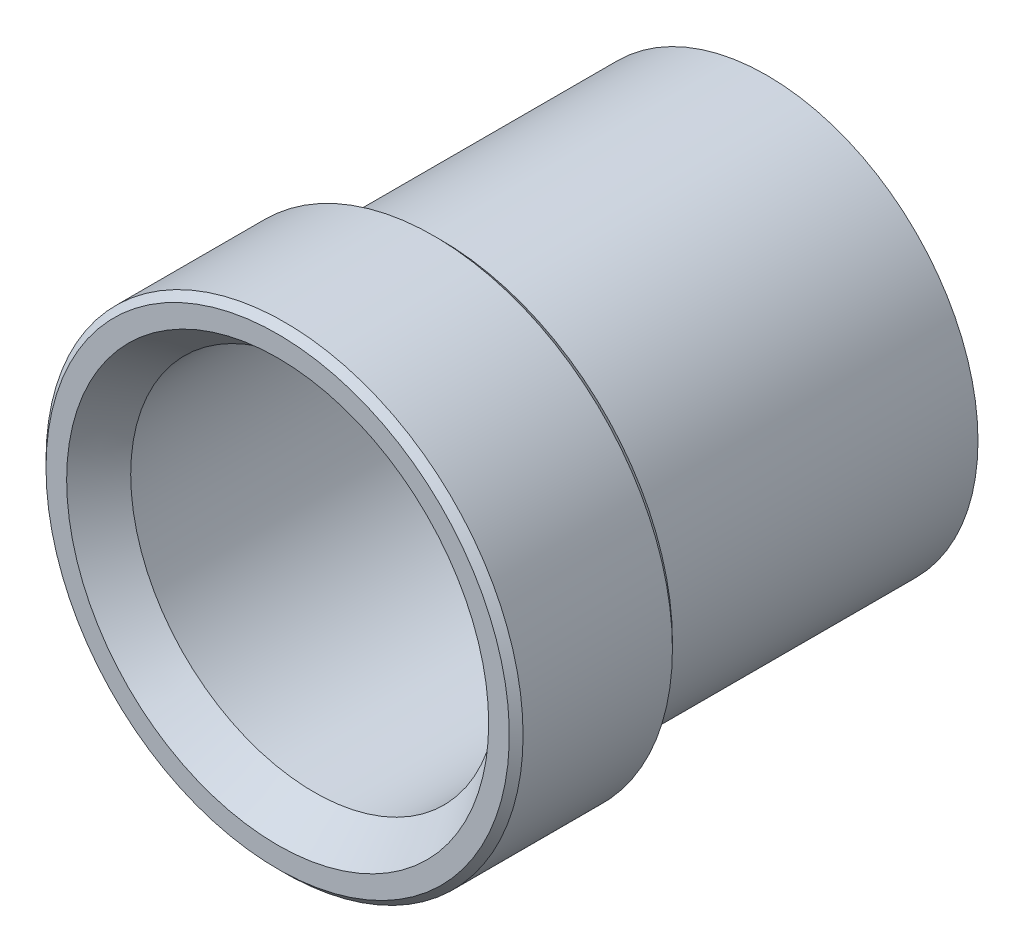
ISO-10303-21;
HEADER;
FILE_DESCRIPTION(('STEP AP214'),'2;1');
FILE_NAME('part.step','',(''),(''),'','','');
FILE_SCHEMA(('AUTOMOTIVE_DESIGN { 1 0 10303 214 1 1 1 1 }'));
ENDSEC;
DATA;
#1=APPLICATION_CONTEXT('core data for automotive mechanical design processes');
#2=APPLICATION_PROTOCOL_DEFINITION('international standard','automotive_design',2000,#1);
#3=PRODUCT_CONTEXT('',#1,'mechanical');
#4=PRODUCT('Part','Part','',(#3));
#5=PRODUCT_RELATED_PRODUCT_CATEGORY('part','',(#4));
#6=PRODUCT_DEFINITION_FORMATION('','',#4);
#7=PRODUCT_DEFINITION_CONTEXT('part definition',#1,'design');
#8=PRODUCT_DEFINITION('design','',#6,#7);
#9=PRODUCT_DEFINITION_SHAPE('','',#8);
#10=(LENGTH_UNIT() NAMED_UNIT(*) SI_UNIT(.MILLI.,.METRE.));
#11=(NAMED_UNIT(*) PLANE_ANGLE_UNIT() SI_UNIT($,.RADIAN.));
#12=(NAMED_UNIT(*) SI_UNIT($,.STERADIAN.) SOLID_ANGLE_UNIT());
#13=UNCERTAINTY_MEASURE_WITH_UNIT(LENGTH_MEASURE(1.E-05),#10,'distance_accuracy_value','');
#14=(GEOMETRIC_REPRESENTATION_CONTEXT(3) GLOBAL_UNCERTAINTY_ASSIGNED_CONTEXT((#13)) GLOBAL_UNIT_ASSIGNED_CONTEXT((#10,
#11,#12)) REPRESENTATION_CONTEXT('',''));
#15=CARTESIAN_POINT('',(0.,0.,0.));
#16=DIRECTION('',(0.,0.,1.));
#17=DIRECTION('',(1.,0.,0.));
#18=AXIS2_PLACEMENT_3D('',#15,#16,#17);
#19=CARTESIAN_POINT('',(0.,0.,6.35));
#20=DIRECTION('',(0.,0.,1.));
#21=DIRECTION('',(1.,0.,0.));
#22=AXIS2_PLACEMENT_3D('',#19,#20,#21);
#23=CYLINDRICAL_SURFACE('',#22,4.7625);
#24=CARTESIAN_POINT('',(0.,0.,-6.35));
#25=DIRECTION('',(0.,0.,1.));
#26=DIRECTION('',(1.,0.,0.));
#27=AXIS2_PLACEMENT_3D('',#24,#25,#26);
#28=CIRCLE('',#27,4.7625);
#29=CARTESIAN_POINT('',(4.7625,0.,-6.35));
#30=VERTEX_POINT('',#29);
#31=EDGE_CURVE('E65',#30,#30,#28,.T.);
#32=ORIENTED_EDGE('',*,*,#31,.F.);
#33=EDGE_LOOP('',(#32));
#34=FACE_BOUND('',#33,.T.);
#35=CARTESIAN_POINT('',(0.,0.,5.40199235555492));
#36=DIRECTION('',(0.,0.,1.));
#37=DIRECTION('',(1.,0.,0.));
#38=AXIS2_PLACEMENT_3D('',#35,#36,#37);
#39=CIRCLE('',#38,4.7625);
#40=CARTESIAN_POINT('',(4.7625,0.,5.40199235555492));
#41=VERTEX_POINT('',#40);
#42=EDGE_CURVE('E53',#41,#41,#39,.T.);
#43=ORIENTED_EDGE('',*,*,#42,.T.);
#44=EDGE_LOOP('',(#43));
#45=FACE_BOUND('',#44,.T.);
#46=ADVANCED_FACE('F33',(#34,#45),#23,.F.);
#47=CARTESIAN_POINT('',(0.,0.,6.35));
#48=DIRECTION('',(0.,0.,1.));
#49=DIRECTION('',(1.,0.,0.));
#50=AXIS2_PLACEMENT_3D('',#47,#48,#49);
#51=CONICAL_SURFACE('',#50,5.476875,0.645771823237903);
#52=ORIENTED_EDGE('',*,*,#42,.F.);
#53=EDGE_LOOP('',(#52));
#54=FACE_BOUND('',#53,.T.);
#55=CARTESIAN_POINT('',(0.,0.,6.35));
#56=DIRECTION('',(0.,0.,1.));
#57=DIRECTION('',(1.,0.,0.));
#58=AXIS2_PLACEMENT_3D('',#55,#56,#57);
#59=CIRCLE('',#58,5.476875);
#60=CARTESIAN_POINT('',(5.476875,0.,6.35));
#61=VERTEX_POINT('',#60);
#62=EDGE_CURVE('E56',#61,#61,#59,.T.);
#63=ORIENTED_EDGE('',*,*,#62,.T.);
#64=EDGE_LOOP('',(#63));
#65=FACE_BOUND('',#64,.T.);
#66=ADVANCED_FACE('F73',(#54,#65),#51,.F.);
#67=CARTESIAN_POINT('',(0.,5.476875,6.35));
#68=DIRECTION('',(0.,0.,-1.));
#69=DIRECTION('',(-1.,0.,0.));
#70=AXIS2_PLACEMENT_3D('',#67,#68,#69);
#71=PLANE('',#70);
#72=CARTESIAN_POINT('',(0.,0.,6.35));
#73=DIRECTION('',(0.,0.,-1.));
#74=DIRECTION('',(-1.,0.,0.));
#75=AXIS2_PLACEMENT_3D('',#72,#73,#74);
#76=CIRCLE('',#75,6.01265625);
#77=CARTESIAN_POINT('',(-6.01265625,0.,6.35));
#78=VERTEX_POINT('',#77);
#79=EDGE_CURVE('E48',#78,#78,#76,.F.);
#80=ORIENTED_EDGE('',*,*,#79,.T.);
#81=EDGE_LOOP('',(#80));
#82=FACE_BOUND('',#81,.T.);
#83=ORIENTED_EDGE('',*,*,#62,.F.);
#84=EDGE_LOOP('',(#83));
#85=FACE_BOUND('',#84,.T.);
#86=ADVANCED_FACE('F79',(#82,#85),#71,.F.);
#87=CARTESIAN_POINT('',(0.,0.,6.35));
#88=DIRECTION('',(0.,0.,1.));
#89=DIRECTION('',(1.,0.,0.));
#90=AXIS2_PLACEMENT_3D('',#87,#88,#89);
#91=CYLINDRICAL_SURFACE('',#90,6.19125);
#92=CARTESIAN_POINT('',(0.,0.,6.17140625));
#93=DIRECTION('',(0.,0.,-1.));
#94=DIRECTION('',(-1.,0.,0.));
#95=AXIS2_PLACEMENT_3D('',#92,#93,#94);
#96=CIRCLE('',#95,6.19125);
#97=CARTESIAN_POINT('',(-6.19125,0.,6.17140625));
#98=VERTEX_POINT('',#97);
#99=EDGE_CURVE('E40',#98,#98,#96,.T.);
#100=ORIENTED_EDGE('',*,*,#99,.T.);
#101=EDGE_LOOP('',(#100));
#102=FACE_BOUND('',#101,.T.);
#103=CARTESIAN_POINT('',(0.,0.,2.29526041666667));
#104=DIRECTION('',(0.,0.,1.));
#105=DIRECTION('',(1.,0.,0.));
#106=AXIS2_PLACEMENT_3D('',#103,#104,#105);
#107=CIRCLE('',#106,6.19125);
#108=CARTESIAN_POINT('',(6.19125,0.,2.29526041666667));
#109=VERTEX_POINT('',#108);
#110=EDGE_CURVE('E44',#109,#109,#107,.T.);
#111=ORIENTED_EDGE('',*,*,#110,.T.);
#112=EDGE_LOOP('',(#111));
#113=FACE_BOUND('',#112,.T.);
#114=ADVANCED_FACE('F84',(#102,#113),#91,.T.);
#115=CARTESIAN_POINT('',(0.,6.19125,2.11666666666667));
#116=DIRECTION('',(0.,0.,1.));
#117=DIRECTION('',(1.,0.,0.));
#118=AXIS2_PLACEMENT_3D('',#115,#116,#117);
#119=PLANE('',#118);
#120=CARTESIAN_POINT('',(0.,0.,2.11666666666667));
#121=DIRECTION('',(0.,0.,1.));
#122=DIRECTION('',(1.,0.,0.));
#123=AXIS2_PLACEMENT_3D('',#120,#121,#122);
#124=CIRCLE('',#123,6.01265625);
#125=CARTESIAN_POINT('',(6.01265625,0.,2.11666666666667));
#126=VERTEX_POINT('',#125);
#127=EDGE_CURVE('E10',#126,#126,#124,.F.);
#128=ORIENTED_EDGE('',*,*,#127,.T.);
#129=EDGE_LOOP('',(#128));
#130=FACE_BOUND('',#129,.T.);
#131=CARTESIAN_POINT('',(0.,0.,2.11666666666667));
#132=DIRECTION('',(0.,0.,1.));
#133=DIRECTION('',(1.,0.,0.));
#134=AXIS2_PLACEMENT_3D('',#131,#132,#133);
#135=CIRCLE('',#134,5.476875);
#136=CARTESIAN_POINT('',(5.476875,0.,2.11666666666667));
#137=VERTEX_POINT('',#136);
#138=EDGE_CURVE('E59',#137,#137,#135,.T.);
#139=ORIENTED_EDGE('',*,*,#138,.T.);
#140=EDGE_LOOP('',(#139));
#141=FACE_BOUND('',#140,.T.);
#142=ADVANCED_FACE('F90',(#130,#141),#119,.F.);
#143=CARTESIAN_POINT('',(0.,0.,6.35));
#144=DIRECTION('',(0.,0.,1.));
#145=DIRECTION('',(1.,0.,0.));
#146=AXIS2_PLACEMENT_3D('',#143,#144,#145);
#147=CYLINDRICAL_SURFACE('',#146,5.476875);
#148=ORIENTED_EDGE('',*,*,#138,.F.);
#149=EDGE_LOOP('',(#148));
#150=FACE_BOUND('',#149,.T.);
#151=CARTESIAN_POINT('',(0.,0.,-6.35));
#152=DIRECTION('',(0.,0.,1.));
#153=DIRECTION('',(1.,0.,0.));
#154=AXIS2_PLACEMENT_3D('',#151,#152,#153);
#155=CIRCLE('',#154,5.476875);
#156=CARTESIAN_POINT('',(5.476875,0.,-6.35));
#157=VERTEX_POINT('',#156);
#158=EDGE_CURVE('E62',#157,#157,#155,.T.);
#159=ORIENTED_EDGE('',*,*,#158,.T.);
#160=EDGE_LOOP('',(#159));
#161=FACE_BOUND('',#160,.T.);
#162=ADVANCED_FACE('F101',(#150,#161),#147,.T.);
#163=CARTESIAN_POINT('',(0.,5.476875,-6.35));
#164=DIRECTION('',(0.,0.,1.));
#165=DIRECTION('',(1.,0.,0.));
#166=AXIS2_PLACEMENT_3D('',#163,#164,#165);
#167=PLANE('',#166);
#168=ORIENTED_EDGE('',*,*,#158,.F.);
#169=EDGE_LOOP('',(#168));
#170=FACE_BOUND('',#169,.T.);
#171=ORIENTED_EDGE('',*,*,#31,.T.);
#172=EDGE_LOOP('',(#171));
#173=FACE_BOUND('',#172,.T.);
#174=ADVANCED_FACE('F69',(#170,#173),#167,.F.);
#175=CARTESIAN_POINT('',(0.,0.,6.35));
#176=DIRECTION('',(0.,0.,-1.));
#177=DIRECTION('',(-1.,0.,0.));
#178=AXIS2_PLACEMENT_3D('',#175,#176,#177);
#179=CONICAL_SURFACE('',#178,6.01265625,0.785398163397446);
#180=ORIENTED_EDGE('',*,*,#99,.F.);
#181=EDGE_LOOP('',(#180));
#182=FACE_BOUND('',#181,.T.);
#183=ORIENTED_EDGE('',*,*,#79,.F.);
#184=EDGE_LOOP('',(#183));
#185=FACE_BOUND('',#184,.T.);
#186=ADVANCED_FACE('F93',(#182,#185),#179,.T.);
#187=CARTESIAN_POINT('',(0.,0.,2.29526041666667));
#188=DIRECTION('',(0.,0.,1.));
#189=DIRECTION('',(1.,0.,0.));
#190=AXIS2_PLACEMENT_3D('',#187,#188,#189);
#191=CONICAL_SURFACE('',#190,6.19125,0.785398163397451);
#192=ORIENTED_EDGE('',*,*,#127,.F.);
#193=EDGE_LOOP('',(#192));
#194=FACE_BOUND('',#193,.T.);
#195=ORIENTED_EDGE('',*,*,#110,.F.);
#196=EDGE_LOOP('',(#195));
#197=FACE_BOUND('',#196,.T.);
#198=ADVANCED_FACE('F35',(#194,#197),#191,.T.);
#199=CLOSED_SHELL('',(#46,#66,#86,#114,#142,#162,#174,#186,#198));
#200=MANIFOLD_SOLID_BREP('B2',#199);
#201=ADVANCED_BREP_SHAPE_REPRESENTATION('',(#18,#200),#14);
#202=SHAPE_DEFINITION_REPRESENTATION(#9,#201);
ENDSEC;
END-ISO-10303-21;
